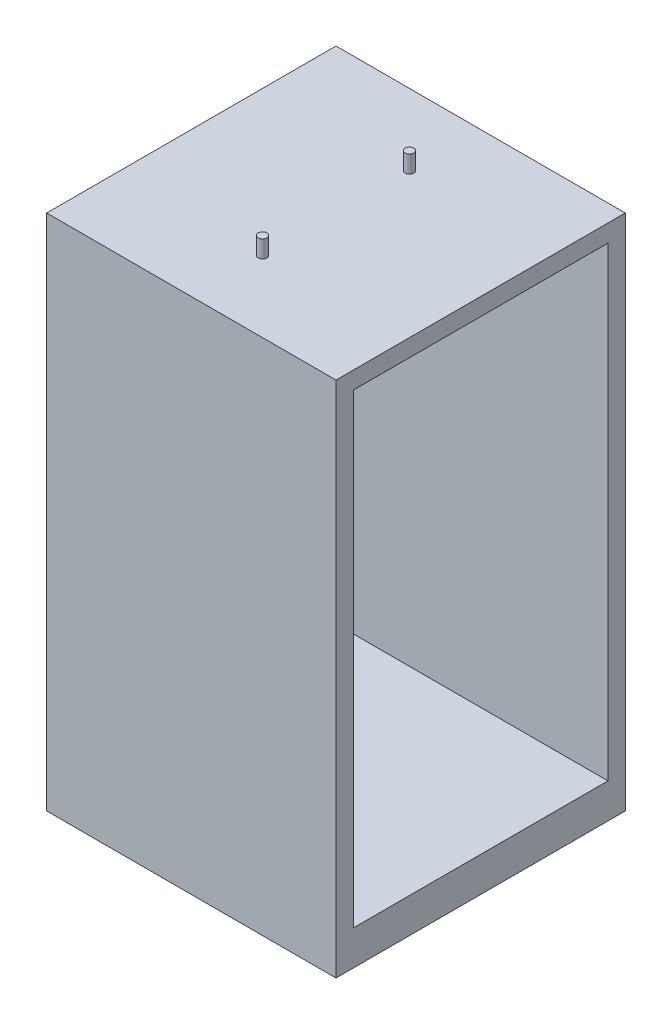
ISO-10303-21;
HEADER;
FILE_DESCRIPTION(('STEP AP214'),'2;1');
FILE_NAME('part.step','',(''),(''),'','','');
FILE_SCHEMA(('AUTOMOTIVE_DESIGN { 1 0 10303 214 1 1 1 1 }'));
ENDSEC;
DATA;
#1=APPLICATION_CONTEXT('core data for automotive mechanical design processes');
#2=APPLICATION_PROTOCOL_DEFINITION('international standard','automotive_design',2000,#1);
#3=PRODUCT_CONTEXT('',#1,'mechanical');
#4=PRODUCT('Part','Part','',(#3));
#5=PRODUCT_RELATED_PRODUCT_CATEGORY('part','',(#4));
#6=PRODUCT_DEFINITION_FORMATION('','',#4);
#7=PRODUCT_DEFINITION_CONTEXT('part definition',#1,'design');
#8=PRODUCT_DEFINITION('design','',#6,#7);
#9=PRODUCT_DEFINITION_SHAPE('','',#8);
#10=(LENGTH_UNIT() NAMED_UNIT(*) SI_UNIT(.MILLI.,.METRE.));
#11=(NAMED_UNIT(*) PLANE_ANGLE_UNIT() SI_UNIT($,.RADIAN.));
#12=(NAMED_UNIT(*) SI_UNIT($,.STERADIAN.) SOLID_ANGLE_UNIT());
#13=UNCERTAINTY_MEASURE_WITH_UNIT(LENGTH_MEASURE(1.E-05),#10,'distance_accuracy_value','');
#14=(GEOMETRIC_REPRESENTATION_CONTEXT(3) GLOBAL_UNCERTAINTY_ASSIGNED_CONTEXT((#13)) GLOBAL_UNIT_ASSIGNED_CONTEXT((#10,
#11,#12)) REPRESENTATION_CONTEXT('',''));
#15=CARTESIAN_POINT('',(0.,0.,0.));
#16=DIRECTION('',(0.,0.,1.));
#17=DIRECTION('',(1.,0.,0.));
#18=AXIS2_PLACEMENT_3D('',#15,#16,#17);
#19=CARTESIAN_POINT('',(-28.1653063417136,89.5,34.6067355359853));
#20=DIRECTION('',(1.,0.,0.));
#21=DIRECTION('',(0.,0.,-1.));
#22=AXIS2_PLACEMENT_3D('',#19,#20,#21);
#23=PLANE('',#22);
#24=DIRECTION('',(0.,0.,1.));
#25=VECTOR('',#24,1.);
#26=CARTESIAN_POINT('',(-28.1653063417136,86.5,34.6067355359853));
#27=LINE('',#26,#25);
#28=CARTESIAN_POINT('',(-28.1653063417136,86.5,-12.3932644640147));
#29=VERTEX_POINT('',#28);
#30=CARTESIAN_POINT('',(-28.1653063417136,86.5,31.6067355359853));
#31=VERTEX_POINT('',#30);
#32=EDGE_CURVE('E130',#29,#31,#27,.T.);
#33=ORIENTED_EDGE('',*,*,#32,.T.);
#34=DIRECTION('',(0.,-1.,0.));
#35=VECTOR('',#34,1.);
#36=CARTESIAN_POINT('',(-28.1653063417136,89.5,31.6067355359853));
#37=LINE('',#36,#35);
#38=CARTESIAN_POINT('',(-28.1653063417136,6.,31.6067355359853));
#39=VERTEX_POINT('',#38);
#40=EDGE_CURVE('E133',#31,#39,#37,.T.);
#41=ORIENTED_EDGE('',*,*,#40,.T.);
#42=DIRECTION('',(0.,0.,-1.));
#43=VECTOR('',#42,1.);
#44=CARTESIAN_POINT('',(-28.1653063417136,6.00000000000002,34.6067355359853));
#45=LINE('',#44,#43);
#46=CARTESIAN_POINT('',(-28.1653063417136,6.00000000000002,-12.3932644640147));
#47=VERTEX_POINT('',#46);
#48=EDGE_CURVE('E125',#39,#47,#45,.T.);
#49=ORIENTED_EDGE('',*,*,#48,.T.);
#50=DIRECTION('',(0.,1.,0.));
#51=VECTOR('',#50,1.);
#52=CARTESIAN_POINT('',(-28.1653063417136,89.5,-12.3932644640147));
#53=LINE('',#52,#51);
#54=EDGE_CURVE('E105',#47,#29,#53,.T.);
#55=ORIENTED_EDGE('',*,*,#54,.T.);
#56=EDGE_LOOP('',(#33,#41,#49,#55));
#57=FACE_BOUND('',#56,.T.);
#58=DIRECTION('',(0.,0.,1.));
#59=VECTOR('',#58,1.);
#60=CARTESIAN_POINT('',(-28.1653063417136,0.,34.6067355359853));
#61=LINE('',#60,#59);
#62=CARTESIAN_POINT('',(-28.1653063417136,0.,-15.3932644640147));
#63=VERTEX_POINT('',#62);
#64=CARTESIAN_POINT('',(-28.1653063417136,0.,34.6067355359853));
#65=VERTEX_POINT('',#64);
#66=EDGE_CURVE('E136',#63,#65,#61,.T.);
#67=ORIENTED_EDGE('',*,*,#66,.T.);
#68=DIRECTION('',(0.,-1.,0.));
#69=VECTOR('',#68,1.);
#70=CARTESIAN_POINT('',(-28.1653063417136,89.5,34.6067355359853));
#71=LINE('',#70,#69);
#72=CARTESIAN_POINT('',(-28.1653063417136,89.5,34.6067355359853));
#73=VERTEX_POINT('',#72);
#74=EDGE_CURVE('E163',#73,#65,#71,.T.);
#75=ORIENTED_EDGE('',*,*,#74,.F.);
#76=DIRECTION('',(0.,0.,1.));
#77=VECTOR('',#76,1.);
#78=CARTESIAN_POINT('',(-28.1653063417136,89.5,34.6067355359853));
#79=LINE('',#78,#77);
#80=CARTESIAN_POINT('',(-28.1653063417136,89.5,-15.3932644640147));
#81=VERTEX_POINT('',#80);
#82=EDGE_CURVE('E137',#81,#73,#79,.T.);
#83=ORIENTED_EDGE('',*,*,#82,.F.);
#84=DIRECTION('',(0.,-1.,0.));
#85=VECTOR('',#84,1.);
#86=CARTESIAN_POINT('',(-28.1653063417136,89.5,-15.3932644640147));
#87=LINE('',#86,#85);
#88=EDGE_CURVE('E147',#81,#63,#87,.T.);
#89=ORIENTED_EDGE('',*,*,#88,.T.);
#90=EDGE_LOOP('',(#67,#75,#83,#89));
#91=FACE_BOUND('',#90,.T.);
#92=ADVANCED_FACE('F35',(#57,#91),#23,.F.);
#93=CARTESIAN_POINT('',(21.8346936582864,89.5,34.6067355359853));
#94=DIRECTION('',(0.,0.,-1.));
#95=DIRECTION('',(-1.,0.,0.));
#96=AXIS2_PLACEMENT_3D('',#93,#94,#95);
#97=PLANE('',#96);
#98=DIRECTION('',(1.,0.,0.));
#99=VECTOR('',#98,1.);
#100=CARTESIAN_POINT('',(21.8346936582864,0.,34.6067355359853));
#101=LINE('',#100,#99);
#102=CARTESIAN_POINT('',(21.8346936582864,0.,34.6067355359853));
#103=VERTEX_POINT('',#102);
#104=EDGE_CURVE('E150',#65,#103,#101,.T.);
#105=ORIENTED_EDGE('',*,*,#104,.T.);
#106=DIRECTION('',(0.,-1.,0.));
#107=VECTOR('',#106,1.);
#108=CARTESIAN_POINT('',(21.8346936582864,89.5,34.6067355359853));
#109=LINE('',#108,#107);
#110=CARTESIAN_POINT('',(21.8346936582864,89.5,34.6067355359853));
#111=VERTEX_POINT('',#110);
#112=EDGE_CURVE('E160',#111,#103,#109,.T.);
#113=ORIENTED_EDGE('',*,*,#112,.F.);
#114=DIRECTION('',(1.,0.,0.));
#115=VECTOR('',#114,1.);
#116=CARTESIAN_POINT('',(21.8346936582864,89.5,34.6067355359853));
#117=LINE('',#116,#115);
#118=EDGE_CURVE('E140',#73,#111,#117,.T.);
#119=ORIENTED_EDGE('',*,*,#118,.F.);
#120=ORIENTED_EDGE('',*,*,#74,.T.);
#121=EDGE_LOOP('',(#105,#113,#119,#120));
#122=FACE_BOUND('',#121,.T.);
#123=ADVANCED_FACE('F185',(#122),#97,.F.);
#124=CARTESIAN_POINT('',(21.8346936582864,89.5,-15.3932644640147));
#125=DIRECTION('',(-1.,0.,0.));
#126=DIRECTION('',(0.,0.,1.));
#127=AXIS2_PLACEMENT_3D('',#124,#125,#126);
#128=PLANE('',#127);
#129=DIRECTION('',(0.,0.,-1.));
#130=VECTOR('',#129,1.);
#131=CARTESIAN_POINT('',(21.8346936582864,6.,31.6067355359853));
#132=LINE('',#131,#130);
#133=CARTESIAN_POINT('',(21.8346936582864,6.00000000000002,31.6067355359853));
#134=VERTEX_POINT('',#133);
#135=CARTESIAN_POINT('',(21.8346936582864,6.,-12.3932644640147));
#136=VERTEX_POINT('',#135);
#137=EDGE_CURVE('E111',#134,#136,#132,.T.);
#138=ORIENTED_EDGE('',*,*,#137,.F.);
#139=DIRECTION('',(0.,-1.,0.));
#140=VECTOR('',#139,1.);
#141=CARTESIAN_POINT('',(21.8346936582864,6.,31.6067355359853));
#142=LINE('',#141,#140);
#143=CARTESIAN_POINT('',(21.8346936582864,86.5,31.6067355359853));
#144=VERTEX_POINT('',#143);
#145=EDGE_CURVE('E57',#144,#134,#142,.T.);
#146=ORIENTED_EDGE('',*,*,#145,.F.);
#147=DIRECTION('',(0.,0.,1.));
#148=VECTOR('',#147,1.);
#149=CARTESIAN_POINT('',(21.8346936582864,86.5,31.6067355359853));
#150=LINE('',#149,#148);
#151=CARTESIAN_POINT('',(21.8346936582864,86.5,-12.3932644640147));
#152=VERTEX_POINT('',#151);
#153=EDGE_CURVE('E118',#152,#144,#150,.T.);
#154=ORIENTED_EDGE('',*,*,#153,.F.);
#155=DIRECTION('',(0.,1.,0.));
#156=VECTOR('',#155,1.);
#157=CARTESIAN_POINT('',(21.8346936582864,6.,-12.3932644640147));
#158=LINE('',#157,#156);
#159=EDGE_CURVE('E102',#136,#152,#158,.T.);
#160=ORIENTED_EDGE('',*,*,#159,.F.);
#161=EDGE_LOOP('',(#138,#146,#154,#160));
#162=FACE_BOUND('',#161,.T.);
#163=DIRECTION('',(0.,0.,-1.));
#164=VECTOR('',#163,1.);
#165=CARTESIAN_POINT('',(21.8346936582864,0.,-15.3932644640147));
#166=LINE('',#165,#164);
#167=CARTESIAN_POINT('',(21.8346936582864,0.,-15.3932644640147));
#168=VERTEX_POINT('',#167);
#169=EDGE_CURVE('E152',#103,#168,#166,.T.);
#170=ORIENTED_EDGE('',*,*,#169,.T.);
#171=DIRECTION('',(0.,-1.,0.));
#172=VECTOR('',#171,1.);
#173=CARTESIAN_POINT('',(21.8346936582864,89.5,-15.3932644640147));
#174=LINE('',#173,#172);
#175=CARTESIAN_POINT('',(21.8346936582864,89.5,-15.3932644640147));
#176=VERTEX_POINT('',#175);
#177=EDGE_CURVE('E157',#176,#168,#174,.T.);
#178=ORIENTED_EDGE('',*,*,#177,.F.);
#179=DIRECTION('',(0.,0.,-1.));
#180=VECTOR('',#179,1.);
#181=CARTESIAN_POINT('',(21.8346936582864,89.5,-15.3932644640147));
#182=LINE('',#181,#180);
#183=EDGE_CURVE('E143',#111,#176,#182,.T.);
#184=ORIENTED_EDGE('',*,*,#183,.F.);
#185=ORIENTED_EDGE('',*,*,#112,.T.);
#186=EDGE_LOOP('',(#170,#178,#184,#185));
#187=FACE_BOUND('',#186,.T.);
#188=ADVANCED_FACE('F115',(#162,#187),#128,.F.);
#189=CARTESIAN_POINT('',(-28.1653063417136,89.5,-15.3932644640147));
#190=DIRECTION('',(0.,0.,1.));
#191=DIRECTION('',(1.,0.,0.));
#192=AXIS2_PLACEMENT_3D('',#189,#190,#191);
#193=PLANE('',#192);
#194=DIRECTION('',(-1.,0.,0.));
#195=VECTOR('',#194,1.);
#196=CARTESIAN_POINT('',(-28.1653063417136,0.,-15.3932644640147));
#197=LINE('',#196,#195);
#198=EDGE_CURVE('E141',#168,#63,#197,.T.);
#199=ORIENTED_EDGE('',*,*,#198,.T.);
#200=ORIENTED_EDGE('',*,*,#88,.F.);
#201=DIRECTION('',(-1.,0.,0.));
#202=VECTOR('',#201,1.);
#203=CARTESIAN_POINT('',(-28.1653063417136,89.5,-15.3932644640147));
#204=LINE('',#203,#202);
#205=EDGE_CURVE('E145',#176,#81,#204,.T.);
#206=ORIENTED_EDGE('',*,*,#205,.F.);
#207=ORIENTED_EDGE('',*,*,#177,.T.);
#208=EDGE_LOOP('',(#199,#200,#206,#207));
#209=FACE_BOUND('',#208,.T.);
#210=ADVANCED_FACE('F174',(#209),#193,.F.);
#211=CARTESIAN_POINT('',(0.,89.5,0.));
#212=DIRECTION('',(0.,-1.,0.));
#213=DIRECTION('',(0.,0.,-1.));
#214=AXIS2_PLACEMENT_3D('',#211,#212,#213);
#215=PLANE('',#214);
#216=CARTESIAN_POINT('',(-3.16530634171358,89.5,-3.0932644640147));
#217=DIRECTION('',(0.,-1.,0.));
#218=DIRECTION('',(0.,0.,-1.));
#219=AXIS2_PLACEMENT_3D('',#216,#217,#218);
#220=CIRCLE('',#219,0.75);
#221=CARTESIAN_POINT('',(-3.16530634171358,89.5,-3.8432644640147));
#222=VERTEX_POINT('',#221);
#223=EDGE_CURVE('E11',#222,#222,#220,.F.);
#224=ORIENTED_EDGE('',*,*,#223,.F.);
#225=EDGE_LOOP('',(#224));
#226=FACE_BOUND('',#225,.T.);
#227=CARTESIAN_POINT('',(-3.16530634171358,89.5,22.3067355359853));
#228=DIRECTION('',(0.,-1.,0.));
#229=DIRECTION('',(0.,0.,-1.));
#230=AXIS2_PLACEMENT_3D('',#227,#228,#229);
#231=CIRCLE('',#230,0.75);
#232=CARTESIAN_POINT('',(-3.16530634171358,89.5,21.5567355359853));
#233=VERTEX_POINT('',#232);
#234=EDGE_CURVE('E42',#233,#233,#231,.F.);
#235=ORIENTED_EDGE('',*,*,#234,.F.);
#236=EDGE_LOOP('',(#235));
#237=FACE_BOUND('',#236,.T.);
#238=ORIENTED_EDGE('',*,*,#82,.T.);
#239=ORIENTED_EDGE('',*,*,#118,.T.);
#240=ORIENTED_EDGE('',*,*,#183,.T.);
#241=ORIENTED_EDGE('',*,*,#205,.T.);
#242=EDGE_LOOP('',(#238,#239,#240,#241));
#243=FACE_BOUND('',#242,.T.);
#244=ADVANCED_FACE('F170',(#226,#237,#243),#215,.F.);
#245=CARTESIAN_POINT('',(0.,0.,0.));
#246=DIRECTION('',(0.,-1.,0.));
#247=DIRECTION('',(0.,0.,-1.));
#248=AXIS2_PLACEMENT_3D('',#245,#246,#247);
#249=PLANE('',#248);
#250=CARTESIAN_POINT('',(-3.16530634171358,0.,22.3067355359853));
#251=DIRECTION('',(0.,-1.,0.));
#252=DIRECTION('',(0.,0.,-1.));
#253=AXIS2_PLACEMENT_3D('',#250,#251,#252);
#254=CIRCLE('',#253,0.75);
#255=CARTESIAN_POINT('',(-3.16530634171358,0.,21.5567355359853));
#256=VERTEX_POINT('',#255);
#257=EDGE_CURVE('E213',#256,#256,#254,.T.);
#258=ORIENTED_EDGE('',*,*,#257,.F.);
#259=EDGE_LOOP('',(#258));
#260=FACE_BOUND('',#259,.T.);
#261=CARTESIAN_POINT('',(-3.16530634171358,0.,-3.0932644640147));
#262=DIRECTION('',(0.,-1.,0.));
#263=DIRECTION('',(0.,0.,-1.));
#264=AXIS2_PLACEMENT_3D('',#261,#262,#263);
#265=CIRCLE('',#264,0.75);
#266=CARTESIAN_POINT('',(-3.16530634171358,0.,-3.8432644640147));
#267=VERTEX_POINT('',#266);
#268=EDGE_CURVE('E219',#267,#267,#265,.T.);
#269=ORIENTED_EDGE('',*,*,#268,.F.);
#270=EDGE_LOOP('',(#269));
#271=FACE_BOUND('',#270,.T.);
#272=ORIENTED_EDGE('',*,*,#66,.F.);
#273=ORIENTED_EDGE('',*,*,#198,.F.);
#274=ORIENTED_EDGE('',*,*,#169,.F.);
#275=ORIENTED_EDGE('',*,*,#104,.F.);
#276=EDGE_LOOP('',(#272,#273,#274,#275));
#277=FACE_BOUND('',#276,.T.);
#278=ADVANCED_FACE('F173',(#260,#271,#277),#249,.T.);
#279=CARTESIAN_POINT('',(-67.6653063417136,6.,31.6067355359853));
#280=DIRECTION('',(0.,0.,1.));
#281=DIRECTION('',(1.,0.,0.));
#282=AXIS2_PLACEMENT_3D('',#279,#280,#281);
#283=PLANE('',#282);
#284=DIRECTION('',(1.,0.,0.));
#285=VECTOR('',#284,1.);
#286=CARTESIAN_POINT('',(-67.6653063417136,86.5,31.6067355359853));
#287=LINE('',#286,#285);
#288=EDGE_CURVE('E123',#31,#144,#287,.T.);
#289=ORIENTED_EDGE('',*,*,#288,.T.);
#290=ORIENTED_EDGE('',*,*,#145,.T.);
#291=DIRECTION('',(1.,0.,0.));
#292=VECTOR('',#291,1.);
#293=CARTESIAN_POINT('',(-67.6653063417136,6.,31.6067355359853));
#294=LINE('',#293,#292);
#295=EDGE_CURVE('E108',#39,#134,#294,.T.);
#296=ORIENTED_EDGE('',*,*,#295,.F.);
#297=ORIENTED_EDGE('',*,*,#40,.F.);
#298=EDGE_LOOP('',(#289,#290,#296,#297));
#299=FACE_BOUND('',#298,.T.);
#300=ADVANCED_FACE('F193',(#299),#283,.F.);
#301=CARTESIAN_POINT('',(-67.6653063417136,86.5,31.6067355359853));
#302=DIRECTION('',(0.,1.,0.));
#303=DIRECTION('',(0.,0.,1.));
#304=AXIS2_PLACEMENT_3D('',#301,#302,#303);
#305=PLANE('',#304);
#306=DIRECTION('',(1.,0.,0.));
#307=VECTOR('',#306,1.);
#308=CARTESIAN_POINT('',(-67.6653063417136,86.5,-12.3932644640147));
#309=LINE('',#308,#307);
#310=EDGE_CURVE('E107',#29,#152,#309,.T.);
#311=ORIENTED_EDGE('',*,*,#310,.T.);
#312=ORIENTED_EDGE('',*,*,#153,.T.);
#313=ORIENTED_EDGE('',*,*,#288,.F.);
#314=ORIENTED_EDGE('',*,*,#32,.F.);
#315=EDGE_LOOP('',(#311,#312,#313,#314));
#316=FACE_BOUND('',#315,.T.);
#317=ADVANCED_FACE('F199',(#316),#305,.F.);
#318=CARTESIAN_POINT('',(-67.6653063417136,6.,-12.3932644640147));
#319=DIRECTION('',(0.,0.,-1.));
#320=DIRECTION('',(-1.,0.,0.));
#321=AXIS2_PLACEMENT_3D('',#318,#319,#320);
#322=PLANE('',#321);
#323=DIRECTION('',(1.,0.,0.));
#324=VECTOR('',#323,1.);
#325=CARTESIAN_POINT('',(-67.6653063417136,6.,-12.3932644640147));
#326=LINE('',#325,#324);
#327=EDGE_CURVE('E49',#47,#136,#326,.T.);
#328=ORIENTED_EDGE('',*,*,#327,.T.);
#329=ORIENTED_EDGE('',*,*,#159,.T.);
#330=ORIENTED_EDGE('',*,*,#310,.F.);
#331=ORIENTED_EDGE('',*,*,#54,.F.);
#332=EDGE_LOOP('',(#328,#329,#330,#331));
#333=FACE_BOUND('',#332,.T.);
#334=ADVANCED_FACE('F99',(#333),#322,.F.);
#335=CARTESIAN_POINT('',(-67.6653063417136,6.,31.6067355359853));
#336=DIRECTION('',(0.,-1.,0.));
#337=DIRECTION('',(0.,0.,-1.));
#338=AXIS2_PLACEMENT_3D('',#335,#336,#337);
#339=PLANE('',#338);
#340=ORIENTED_EDGE('',*,*,#295,.T.);
#341=ORIENTED_EDGE('',*,*,#137,.T.);
#342=ORIENTED_EDGE('',*,*,#327,.F.);
#343=ORIENTED_EDGE('',*,*,#48,.F.);
#344=EDGE_LOOP('',(#340,#341,#342,#343));
#345=FACE_BOUND('',#344,.T.);
#346=ADVANCED_FACE('F112',(#345),#339,.F.);
#347=CARTESIAN_POINT('',(-3.16530634171358,3.,-3.0932644640147));
#348=DIRECTION('',(0.,-1.,0.));
#349=DIRECTION('',(0.,0.,-1.));
#350=AXIS2_PLACEMENT_3D('',#347,#348,#349);
#351=CYLINDRICAL_SURFACE('',#350,0.75);
#352=CARTESIAN_POINT('',(-3.16530634171358,3.,-3.0932644640147));
#353=DIRECTION('',(0.,-1.,0.));
#354=DIRECTION('',(0.,0.,-1.));
#355=AXIS2_PLACEMENT_3D('',#352,#353,#354);
#356=CIRCLE('',#355,0.75);
#357=CARTESIAN_POINT('',(-3.16530634171358,3.,-3.8432644640147));
#358=VERTEX_POINT('',#357);
#359=EDGE_CURVE('E216',#358,#358,#356,.T.);
#360=ORIENTED_EDGE('',*,*,#359,.F.);
#361=EDGE_LOOP('',(#360));
#362=FACE_BOUND('',#361,.T.);
#363=ORIENTED_EDGE('',*,*,#268,.T.);
#364=EDGE_LOOP('',(#363));
#365=FACE_BOUND('',#364,.T.);
#366=ADVANCED_FACE('F259',(#362,#365),#351,.F.);
#367=CARTESIAN_POINT('',(-3.16530634171358,3.,-3.0932644640147));
#368=DIRECTION('',(0.,-1.,0.));
#369=DIRECTION('',(0.,0.,-1.));
#370=AXIS2_PLACEMENT_3D('',#367,#368,#369);
#371=PLANE('',#370);
#372=ORIENTED_EDGE('',*,*,#359,.T.);
#373=EDGE_LOOP('',(#372));
#374=FACE_BOUND('',#373,.T.);
#375=ADVANCED_FACE('F257',(#374),#371,.T.);
#376=CARTESIAN_POINT('',(-3.16530634171358,3.,22.3067355359853));
#377=DIRECTION('',(0.,-1.,0.));
#378=DIRECTION('',(0.,0.,-1.));
#379=AXIS2_PLACEMENT_3D('',#376,#377,#378);
#380=CYLINDRICAL_SURFACE('',#379,0.75);
#381=CARTESIAN_POINT('',(-3.16530634171358,3.,22.3067355359853));
#382=DIRECTION('',(0.,-1.,0.));
#383=DIRECTION('',(0.,0.,-1.));
#384=AXIS2_PLACEMENT_3D('',#381,#382,#383);
#385=CIRCLE('',#384,0.75);
#386=CARTESIAN_POINT('',(-3.16530634171358,3.,21.5567355359853));
#387=VERTEX_POINT('',#386);
#388=EDGE_CURVE('E211',#387,#387,#385,.T.);
#389=ORIENTED_EDGE('',*,*,#388,.F.);
#390=EDGE_LOOP('',(#389));
#391=FACE_BOUND('',#390,.T.);
#392=ORIENTED_EDGE('',*,*,#257,.T.);
#393=EDGE_LOOP('',(#392));
#394=FACE_BOUND('',#393,.T.);
#395=ADVANCED_FACE('F253',(#391,#394),#380,.F.);
#396=CARTESIAN_POINT('',(-3.16530634171358,3.,22.3067355359853));
#397=DIRECTION('',(0.,-1.,0.));
#398=DIRECTION('',(0.,0.,-1.));
#399=AXIS2_PLACEMENT_3D('',#396,#397,#398);
#400=PLANE('',#399);
#401=ORIENTED_EDGE('',*,*,#388,.T.);
#402=EDGE_LOOP('',(#401));
#403=FACE_BOUND('',#402,.T.);
#404=ADVANCED_FACE('F249',(#403),#400,.T.);
#405=CARTESIAN_POINT('',(-3.16530634171358,92.5,22.3067355359853));
#406=DIRECTION('',(0.,-1.,0.));
#407=DIRECTION('',(0.,0.,-1.));
#408=AXIS2_PLACEMENT_3D('',#405,#406,#407);
#409=CYLINDRICAL_SURFACE('',#408,0.75);
#410=CARTESIAN_POINT('',(-3.16530634171358,92.5,22.3067355359853));
#411=DIRECTION('',(0.,1.,0.));
#412=DIRECTION('',(0.,0.,1.));
#413=AXIS2_PLACEMENT_3D('',#410,#411,#412);
#414=CIRCLE('',#413,0.75);
#415=CARTESIAN_POINT('',(-3.16530634171358,92.5,23.0567355359853));
#416=VERTEX_POINT('',#415);
#417=EDGE_CURVE('E220',#416,#416,#414,.T.);
#418=ORIENTED_EDGE('',*,*,#417,.F.);
#419=EDGE_LOOP('',(#418));
#420=FACE_BOUND('',#419,.T.);
#421=ORIENTED_EDGE('',*,*,#234,.T.);
#422=EDGE_LOOP('',(#421));
#423=FACE_BOUND('',#422,.T.);
#424=ADVANCED_FACE('F168',(#420,#423),#409,.T.);
#425=CARTESIAN_POINT('',(-3.16530634171358,92.5,22.3067355359853));
#426=DIRECTION('',(0.,1.,0.));
#427=DIRECTION('',(0.,0.,1.));
#428=AXIS2_PLACEMENT_3D('',#425,#426,#427);
#429=PLANE('',#428);
#430=ORIENTED_EDGE('',*,*,#417,.T.);
#431=EDGE_LOOP('',(#430));
#432=FACE_BOUND('',#431,.T.);
#433=ADVANCED_FACE('F236',(#432),#429,.T.);
#434=CARTESIAN_POINT('',(-3.16530634171358,92.5,-3.0932644640147));
#435=DIRECTION('',(0.,-1.,0.));
#436=DIRECTION('',(0.,0.,-1.));
#437=AXIS2_PLACEMENT_3D('',#434,#435,#436);
#438=CYLINDRICAL_SURFACE('',#437,0.75);
#439=CARTESIAN_POINT('',(-3.16530634171358,92.5,-3.0932644640147));
#440=DIRECTION('',(0.,1.,0.));
#441=DIRECTION('',(0.,0.,1.));
#442=AXIS2_PLACEMENT_3D('',#439,#440,#441);
#443=CIRCLE('',#442,0.75);
#444=CARTESIAN_POINT('',(-3.16530634171358,92.5,-2.3432644640147));
#445=VERTEX_POINT('',#444);
#446=EDGE_CURVE('E227',#445,#445,#443,.T.);
#447=ORIENTED_EDGE('',*,*,#446,.F.);
#448=EDGE_LOOP('',(#447));
#449=FACE_BOUND('',#448,.T.);
#450=ORIENTED_EDGE('',*,*,#223,.T.);
#451=EDGE_LOOP('',(#450));
#452=FACE_BOUND('',#451,.T.);
#453=ADVANCED_FACE('F233',(#449,#452),#438,.T.);
#454=CARTESIAN_POINT('',(-3.16530634171358,92.5,-3.0932644640147));
#455=DIRECTION('',(0.,1.,0.));
#456=DIRECTION('',(0.,0.,1.));
#457=AXIS2_PLACEMENT_3D('',#454,#455,#456);
#458=PLANE('',#457);
#459=ORIENTED_EDGE('',*,*,#446,.T.);
#460=EDGE_LOOP('',(#459));
#461=FACE_BOUND('',#460,.T.);
#462=ADVANCED_FACE('F231',(#461),#458,.T.);
#463=CLOSED_SHELL('',(#92,#123,#188,#210,#244,#278,#300,#317,#334,#346,#366,#375,#395,#404,#424,
#433,#453,#462));
#464=MANIFOLD_SOLID_BREP('B2',#463);
#465=ADVANCED_BREP_SHAPE_REPRESENTATION('',(#18,#464),#14);
#466=SHAPE_DEFINITION_REPRESENTATION(#9,#465);
ENDSEC;
END-ISO-10303-21;
